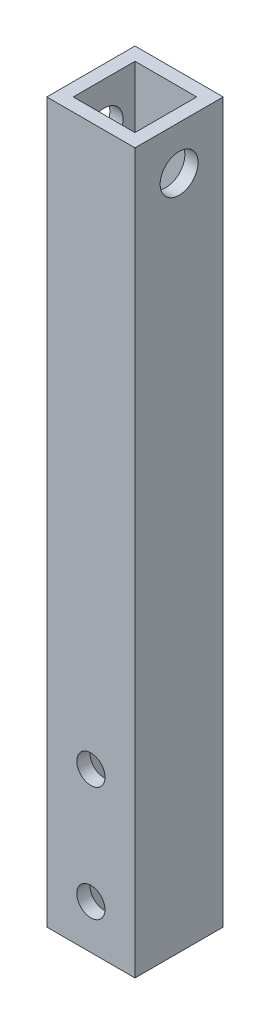
ISO-10303-21;
HEADER;
FILE_DESCRIPTION(('STEP AP214'),'2;1');
FILE_NAME('part.step','',(''),(''),'','','');
FILE_SCHEMA(('AUTOMOTIVE_DESIGN { 1 0 10303 214 1 1 1 1 }'));
ENDSEC;
DATA;
#1=APPLICATION_CONTEXT('core data for automotive mechanical design processes');
#2=APPLICATION_PROTOCOL_DEFINITION('international standard','automotive_design',2000,#1);
#3=PRODUCT_CONTEXT('',#1,'mechanical');
#4=PRODUCT('Part','Part','',(#3));
#5=PRODUCT_RELATED_PRODUCT_CATEGORY('part','',(#4));
#6=PRODUCT_DEFINITION_FORMATION('','',#4);
#7=PRODUCT_DEFINITION_CONTEXT('part definition',#1,'design');
#8=PRODUCT_DEFINITION('design','',#6,#7);
#9=PRODUCT_DEFINITION_SHAPE('','',#8);
#10=(LENGTH_UNIT() NAMED_UNIT(*) SI_UNIT(.MILLI.,.METRE.));
#11=(NAMED_UNIT(*) PLANE_ANGLE_UNIT() SI_UNIT($,.RADIAN.));
#12=(NAMED_UNIT(*) SI_UNIT($,.STERADIAN.) SOLID_ANGLE_UNIT());
#13=UNCERTAINTY_MEASURE_WITH_UNIT(LENGTH_MEASURE(1.E-05),#10,'distance_accuracy_value','');
#14=(GEOMETRIC_REPRESENTATION_CONTEXT(3) GLOBAL_UNCERTAINTY_ASSIGNED_CONTEXT((#13)) GLOBAL_UNIT_ASSIGNED_CONTEXT((#10,
#11,#12)) REPRESENTATION_CONTEXT('',''));
#15=CARTESIAN_POINT('',(0.,0.,0.));
#16=DIRECTION('',(0.,0.,1.));
#17=DIRECTION('',(1.,0.,0.));
#18=AXIS2_PLACEMENT_3D('',#15,#16,#17);
#19=CARTESIAN_POINT('',(0.,81.5,0.));
#20=DIRECTION('',(0.,1.,0.));
#21=DIRECTION('',(0.,0.,1.));
#22=AXIS2_PLACEMENT_3D('',#19,#20,#21);
#23=PLANE('',#22);
#24=DIRECTION('',(0.,0.,-1.));
#25=VECTOR('',#24,1.);
#26=CARTESIAN_POINT('',(5.,81.5,-5.));
#27=LINE('',#26,#25);
#28=CARTESIAN_POINT('',(5.,81.5,5.));
#29=VERTEX_POINT('',#28);
#30=CARTESIAN_POINT('',(5.,81.5,-5.));
#31=VERTEX_POINT('',#30);
#32=EDGE_CURVE('E164',#29,#31,#27,.T.);
#33=ORIENTED_EDGE('',*,*,#32,.T.);
#34=DIRECTION('',(-1.,0.,0.));
#35=VECTOR('',#34,1.);
#36=CARTESIAN_POINT('',(-5.,81.5,-5.));
#37=LINE('',#36,#35);
#38=CARTESIAN_POINT('',(-5.,81.5,-5.));
#39=VERTEX_POINT('',#38);
#40=EDGE_CURVE('E167',#31,#39,#37,.T.);
#41=ORIENTED_EDGE('',*,*,#40,.T.);
#42=DIRECTION('',(0.,0.,1.));
#43=VECTOR('',#42,1.);
#44=CARTESIAN_POINT('',(-5.,81.5,-5.));
#45=LINE('',#44,#43);
#46=CARTESIAN_POINT('',(-5.,81.5,5.));
#47=VERTEX_POINT('',#46);
#48=EDGE_CURVE('E170',#39,#47,#45,.T.);
#49=ORIENTED_EDGE('',*,*,#48,.T.);
#50=DIRECTION('',(1.,0.,0.));
#51=VECTOR('',#50,1.);
#52=CARTESIAN_POINT('',(-5.,81.5,5.));
#53=LINE('',#52,#51);
#54=EDGE_CURVE('E172',#47,#29,#53,.T.);
#55=ORIENTED_EDGE('',*,*,#54,.T.);
#56=EDGE_LOOP('',(#33,#41,#49,#55));
#57=FACE_BOUND('',#56,.T.);
#58=DIRECTION('',(-1.,0.,0.));
#59=VECTOR('',#58,1.);
#60=CARTESIAN_POINT('',(-5.,81.5,-3.5));
#61=LINE('',#60,#59);
#62=CARTESIAN_POINT('',(3.5,81.5,-3.5));
#63=VERTEX_POINT('',#62);
#64=CARTESIAN_POINT('',(-3.5,81.5,-3.5));
#65=VERTEX_POINT('',#64);
#66=EDGE_CURVE('E134',#63,#65,#61,.T.);
#67=ORIENTED_EDGE('',*,*,#66,.F.);
#68=DIRECTION('',(0.,0.,-1.));
#69=VECTOR('',#68,1.);
#70=CARTESIAN_POINT('',(3.5,81.5,-5.));
#71=LINE('',#70,#69);
#72=CARTESIAN_POINT('',(3.5,81.5,3.5));
#73=VERTEX_POINT('',#72);
#74=EDGE_CURVE('E126',#73,#63,#71,.T.);
#75=ORIENTED_EDGE('',*,*,#74,.F.);
#76=DIRECTION('',(1.,0.,0.));
#77=VECTOR('',#76,1.);
#78=CARTESIAN_POINT('',(-5.,81.5,3.5));
#79=LINE('',#78,#77);
#80=CARTESIAN_POINT('',(-3.5,81.5,3.5));
#81=VERTEX_POINT('',#80);
#82=EDGE_CURVE('E148',#81,#73,#79,.T.);
#83=ORIENTED_EDGE('',*,*,#82,.F.);
#84=DIRECTION('',(0.,0.,1.));
#85=VECTOR('',#84,1.);
#86=CARTESIAN_POINT('',(-3.5,81.5,-5.));
#87=LINE('',#86,#85);
#88=EDGE_CURVE('E146',#65,#81,#87,.T.);
#89=ORIENTED_EDGE('',*,*,#88,.F.);
#90=EDGE_LOOP('',(#67,#75,#83,#89));
#91=FACE_BOUND('',#90,.T.);
#92=ADVANCED_FACE('F59',(#57,#91),#23,.T.);
#93=CARTESIAN_POINT('',(0.,0.,0.));
#94=DIRECTION('',(0.,1.,0.));
#95=DIRECTION('',(0.,0.,1.));
#96=AXIS2_PLACEMENT_3D('',#93,#94,#95);
#97=PLANE('',#96);
#98=DIRECTION('',(0.,0.,-1.));
#99=VECTOR('',#98,1.);
#100=CARTESIAN_POINT('',(5.,0.,-5.));
#101=LINE('',#100,#99);
#102=CARTESIAN_POINT('',(5.,0.,5.));
#103=VERTEX_POINT('',#102);
#104=CARTESIAN_POINT('',(5.,0.,-5.));
#105=VERTEX_POINT('',#104);
#106=EDGE_CURVE('E142',#103,#105,#101,.T.);
#107=ORIENTED_EDGE('',*,*,#106,.F.);
#108=DIRECTION('',(1.,0.,0.));
#109=VECTOR('',#108,1.);
#110=CARTESIAN_POINT('',(-5.,0.,5.));
#111=LINE('',#110,#109);
#112=CARTESIAN_POINT('',(-5.,0.,5.));
#113=VERTEX_POINT('',#112);
#114=EDGE_CURVE('E168',#113,#103,#111,.T.);
#115=ORIENTED_EDGE('',*,*,#114,.F.);
#116=DIRECTION('',(0.,0.,1.));
#117=VECTOR('',#116,1.);
#118=CARTESIAN_POINT('',(-5.,0.,-5.));
#119=LINE('',#118,#117);
#120=CARTESIAN_POINT('',(-5.,0.,-5.));
#121=VERTEX_POINT('',#120);
#122=EDGE_CURVE('E179',#121,#113,#119,.T.);
#123=ORIENTED_EDGE('',*,*,#122,.F.);
#124=DIRECTION('',(-1.,0.,0.));
#125=VECTOR('',#124,1.);
#126=CARTESIAN_POINT('',(-5.,0.,-5.));
#127=LINE('',#126,#125);
#128=EDGE_CURVE('E177',#105,#121,#127,.T.);
#129=ORIENTED_EDGE('',*,*,#128,.F.);
#130=EDGE_LOOP('',(#107,#115,#123,#129));
#131=FACE_BOUND('',#130,.T.);
#132=DIRECTION('',(0.,0.,-1.));
#133=VECTOR('',#132,1.);
#134=CARTESIAN_POINT('',(3.5,0.,-5.));
#135=LINE('',#134,#133);
#136=CARTESIAN_POINT('',(3.5,0.,3.5));
#137=VERTEX_POINT('',#136);
#138=CARTESIAN_POINT('',(3.5,0.,-3.5));
#139=VERTEX_POINT('',#138);
#140=EDGE_CURVE('E84',#137,#139,#135,.T.);
#141=ORIENTED_EDGE('',*,*,#140,.T.);
#142=DIRECTION('',(-1.,0.,0.));
#143=VECTOR('',#142,1.);
#144=CARTESIAN_POINT('',(-5.,0.,-3.5));
#145=LINE('',#144,#143);
#146=CARTESIAN_POINT('',(-3.5,0.,-3.5));
#147=VERTEX_POINT('',#146);
#148=EDGE_CURVE('E141',#139,#147,#145,.T.);
#149=ORIENTED_EDGE('',*,*,#148,.T.);
#150=DIRECTION('',(0.,0.,1.));
#151=VECTOR('',#150,1.);
#152=CARTESIAN_POINT('',(-3.5,0.,-5.));
#153=LINE('',#152,#151);
#154=CARTESIAN_POINT('',(-3.5,0.,3.5));
#155=VERTEX_POINT('',#154);
#156=EDGE_CURVE('E156',#147,#155,#153,.T.);
#157=ORIENTED_EDGE('',*,*,#156,.T.);
#158=DIRECTION('',(1.,0.,0.));
#159=VECTOR('',#158,1.);
#160=CARTESIAN_POINT('',(-5.,0.,3.5));
#161=LINE('',#160,#159);
#162=EDGE_CURVE('E135',#155,#137,#161,.T.);
#163=ORIENTED_EDGE('',*,*,#162,.T.);
#164=EDGE_LOOP('',(#141,#149,#157,#163));
#165=FACE_BOUND('',#164,.T.);
#166=ADVANCED_FACE('F237',(#131,#165),#97,.F.);
#167=CARTESIAN_POINT('',(5.,81.5,-5.));
#168=DIRECTION('',(-1.,0.,0.));
#169=DIRECTION('',(0.,0.,1.));
#170=AXIS2_PLACEMENT_3D('',#167,#168,#169);
#171=PLANE('',#170);
#172=CARTESIAN_POINT('',(5.,76.5,0.));
#173=DIRECTION('',(1.,0.,0.));
#174=DIRECTION('',(0.,0.,-1.));
#175=AXIS2_PLACEMENT_3D('',#172,#173,#174);
#176=CIRCLE('',#175,2.15);
#177=CARTESIAN_POINT('',(5.,76.5,-2.15));
#178=VERTEX_POINT('',#177);
#179=EDGE_CURVE('E217',#178,#178,#176,.T.);
#180=ORIENTED_EDGE('',*,*,#179,.F.);
#181=EDGE_LOOP('',(#180));
#182=FACE_BOUND('',#181,.T.);
#183=ORIENTED_EDGE('',*,*,#106,.T.);
#184=DIRECTION('',(0.,-1.,0.));
#185=VECTOR('',#184,1.);
#186=CARTESIAN_POINT('',(5.,81.5,-5.));
#187=LINE('',#186,#185);
#188=EDGE_CURVE('E12',#31,#105,#187,.T.);
#189=ORIENTED_EDGE('',*,*,#188,.F.);
#190=ORIENTED_EDGE('',*,*,#32,.F.);
#191=DIRECTION('',(0.,-1.,0.));
#192=VECTOR('',#191,1.);
#193=CARTESIAN_POINT('',(5.,81.5,5.));
#194=LINE('',#193,#192);
#195=EDGE_CURVE('E174',#29,#103,#194,.T.);
#196=ORIENTED_EDGE('',*,*,#195,.T.);
#197=EDGE_LOOP('',(#183,#189,#190,#196));
#198=FACE_BOUND('',#197,.T.);
#199=ADVANCED_FACE('F61',(#182,#198),#171,.F.);
#200=CARTESIAN_POINT('',(-5.,81.5,-5.));
#201=DIRECTION('',(0.,0.,1.));
#202=DIRECTION('',(1.,0.,0.));
#203=AXIS2_PLACEMENT_3D('',#200,#201,#202);
#204=PLANE('',#203);
#205=CARTESIAN_POINT('',(0.,18.,-5.));
#206=DIRECTION('',(0.,0.,1.));
#207=DIRECTION('',(1.,0.,0.));
#208=AXIS2_PLACEMENT_3D('',#205,#206,#207);
#209=CIRCLE('',#208,1.6);
#210=CARTESIAN_POINT('',(1.6,18.,-5.));
#211=VERTEX_POINT('',#210);
#212=EDGE_CURVE('E192',#211,#211,#209,.T.);
#213=ORIENTED_EDGE('',*,*,#212,.T.);
#214=EDGE_LOOP('',(#213));
#215=FACE_BOUND('',#214,.T.);
#216=CARTESIAN_POINT('',(0.,5.,-5.));
#217=DIRECTION('',(0.,0.,1.));
#218=DIRECTION('',(1.,0.,0.));
#219=AXIS2_PLACEMENT_3D('',#216,#217,#218);
#220=CIRCLE('',#219,1.6);
#221=CARTESIAN_POINT('',(1.6,5.,-5.));
#222=VERTEX_POINT('',#221);
#223=EDGE_CURVE('E206',#222,#222,#220,.T.);
#224=ORIENTED_EDGE('',*,*,#223,.T.);
#225=EDGE_LOOP('',(#224));
#226=FACE_BOUND('',#225,.T.);
#227=ORIENTED_EDGE('',*,*,#128,.T.);
#228=DIRECTION('',(0.,-1.,0.));
#229=VECTOR('',#228,1.);
#230=CARTESIAN_POINT('',(-5.,81.5,-5.));
#231=LINE('',#230,#229);
#232=EDGE_CURVE('E68',#39,#121,#231,.T.);
#233=ORIENTED_EDGE('',*,*,#232,.F.);
#234=ORIENTED_EDGE('',*,*,#40,.F.);
#235=ORIENTED_EDGE('',*,*,#188,.T.);
#236=EDGE_LOOP('',(#227,#233,#234,#235));
#237=FACE_BOUND('',#236,.T.);
#238=ADVANCED_FACE('F267',(#215,#226,#237),#204,.F.);
#239=CARTESIAN_POINT('',(-5.,81.5,-5.));
#240=DIRECTION('',(1.,0.,0.));
#241=DIRECTION('',(0.,0.,-1.));
#242=AXIS2_PLACEMENT_3D('',#239,#240,#241);
#243=PLANE('',#242);
#244=CARTESIAN_POINT('',(-5.,76.5,0.));
#245=DIRECTION('',(1.,0.,0.));
#246=DIRECTION('',(0.,0.,-1.));
#247=AXIS2_PLACEMENT_3D('',#244,#245,#246);
#248=CIRCLE('',#247,2.15);
#249=CARTESIAN_POINT('',(-5.,76.5,-2.15));
#250=VERTEX_POINT('',#249);
#251=EDGE_CURVE('E220',#250,#250,#248,.T.);
#252=ORIENTED_EDGE('',*,*,#251,.T.);
#253=EDGE_LOOP('',(#252));
#254=FACE_BOUND('',#253,.T.);
#255=ORIENTED_EDGE('',*,*,#122,.T.);
#256=DIRECTION('',(0.,-1.,0.));
#257=VECTOR('',#256,1.);
#258=CARTESIAN_POINT('',(-5.,81.5,5.));
#259=LINE('',#258,#257);
#260=EDGE_CURVE('E184',#47,#113,#259,.T.);
#261=ORIENTED_EDGE('',*,*,#260,.F.);
#262=ORIENTED_EDGE('',*,*,#48,.F.);
#263=ORIENTED_EDGE('',*,*,#232,.T.);
#264=EDGE_LOOP('',(#255,#261,#262,#263));
#265=FACE_BOUND('',#264,.T.);
#266=ADVANCED_FACE('F264',(#254,#265),#243,.F.);
#267=CARTESIAN_POINT('',(-5.,81.5,5.));
#268=DIRECTION('',(0.,0.,-1.));
#269=DIRECTION('',(-1.,0.,0.));
#270=AXIS2_PLACEMENT_3D('',#267,#268,#269);
#271=PLANE('',#270);
#272=CARTESIAN_POINT('',(0.,18.,5.));
#273=DIRECTION('',(0.,0.,1.));
#274=DIRECTION('',(1.,0.,0.));
#275=AXIS2_PLACEMENT_3D('',#272,#273,#274);
#276=CIRCLE('',#275,1.6);
#277=CARTESIAN_POINT('',(1.6,18.,5.));
#278=VERTEX_POINT('',#277);
#279=EDGE_CURVE('E210',#278,#278,#276,.T.);
#280=ORIENTED_EDGE('',*,*,#279,.F.);
#281=EDGE_LOOP('',(#280));
#282=FACE_BOUND('',#281,.T.);
#283=CARTESIAN_POINT('',(0.,5.,5.));
#284=DIRECTION('',(0.,0.,1.));
#285=DIRECTION('',(1.,0.,0.));
#286=AXIS2_PLACEMENT_3D('',#283,#284,#285);
#287=CIRCLE('',#286,1.6);
#288=CARTESIAN_POINT('',(1.6,5.,5.));
#289=VERTEX_POINT('',#288);
#290=EDGE_CURVE('E203',#289,#289,#287,.T.);
#291=ORIENTED_EDGE('',*,*,#290,.F.);
#292=EDGE_LOOP('',(#291));
#293=FACE_BOUND('',#292,.T.);
#294=ORIENTED_EDGE('',*,*,#114,.T.);
#295=ORIENTED_EDGE('',*,*,#195,.F.);
#296=ORIENTED_EDGE('',*,*,#54,.F.);
#297=ORIENTED_EDGE('',*,*,#260,.T.);
#298=EDGE_LOOP('',(#294,#295,#296,#297));
#299=FACE_BOUND('',#298,.T.);
#300=ADVANCED_FACE('F261',(#282,#293,#299),#271,.F.);
#301=CARTESIAN_POINT('',(3.5,81.5,-5.));
#302=DIRECTION('',(-1.,0.,0.));
#303=DIRECTION('',(0.,0.,1.));
#304=AXIS2_PLACEMENT_3D('',#301,#302,#303);
#305=PLANE('',#304);
#306=CARTESIAN_POINT('',(3.5,76.5,0.));
#307=DIRECTION('',(-1.,0.,0.));
#308=DIRECTION('',(0.,0.,1.));
#309=AXIS2_PLACEMENT_3D('',#306,#307,#308);
#310=CIRCLE('',#309,2.15);
#311=CARTESIAN_POINT('',(3.5,76.5,2.15));
#312=VERTEX_POINT('',#311);
#313=EDGE_CURVE('E207',#312,#312,#310,.T.);
#314=ORIENTED_EDGE('',*,*,#313,.F.);
#315=EDGE_LOOP('',(#314));
#316=FACE_BOUND('',#315,.T.);
#317=ORIENTED_EDGE('',*,*,#140,.F.);
#318=DIRECTION('',(0.,-1.,0.));
#319=VECTOR('',#318,1.);
#320=CARTESIAN_POINT('',(3.5,81.5,3.5));
#321=LINE('',#320,#319);
#322=EDGE_CURVE('E130',#73,#137,#321,.T.);
#323=ORIENTED_EDGE('',*,*,#322,.F.);
#324=ORIENTED_EDGE('',*,*,#74,.T.);
#325=DIRECTION('',(0.,-1.,0.));
#326=VECTOR('',#325,1.);
#327=CARTESIAN_POINT('',(3.5,81.5,-3.5));
#328=LINE('',#327,#326);
#329=EDGE_CURVE('E129',#63,#139,#328,.T.);
#330=ORIENTED_EDGE('',*,*,#329,.T.);
#331=EDGE_LOOP('',(#317,#323,#324,#330));
#332=FACE_BOUND('',#331,.T.);
#333=ADVANCED_FACE('F128',(#316,#332),#305,.T.);
#334=CARTESIAN_POINT('',(-5.,81.5,-3.5));
#335=DIRECTION('',(0.,0.,1.));
#336=DIRECTION('',(1.,0.,0.));
#337=AXIS2_PLACEMENT_3D('',#334,#335,#336);
#338=PLANE('',#337);
#339=CARTESIAN_POINT('',(0.,18.,-3.5));
#340=DIRECTION('',(0.,0.,1.));
#341=DIRECTION('',(1.,0.,0.));
#342=AXIS2_PLACEMENT_3D('',#339,#340,#341);
#343=CIRCLE('',#342,1.6);
#344=CARTESIAN_POINT('',(1.6,18.,-3.5));
#345=VERTEX_POINT('',#344);
#346=EDGE_CURVE('E154',#345,#345,#343,.T.);
#347=ORIENTED_EDGE('',*,*,#346,.F.);
#348=EDGE_LOOP('',(#347));
#349=FACE_BOUND('',#348,.T.);
#350=CARTESIAN_POINT('',(0.,5.,-3.5));
#351=DIRECTION('',(0.,0.,1.));
#352=DIRECTION('',(1.,0.,0.));
#353=AXIS2_PLACEMENT_3D('',#350,#351,#352);
#354=CIRCLE('',#353,1.6);
#355=CARTESIAN_POINT('',(1.6,5.,-3.5));
#356=VERTEX_POINT('',#355);
#357=EDGE_CURVE('E191',#356,#356,#354,.T.);
#358=ORIENTED_EDGE('',*,*,#357,.F.);
#359=EDGE_LOOP('',(#358));
#360=FACE_BOUND('',#359,.T.);
#361=ORIENTED_EDGE('',*,*,#148,.F.);
#362=ORIENTED_EDGE('',*,*,#329,.F.);
#363=ORIENTED_EDGE('',*,*,#66,.T.);
#364=DIRECTION('',(0.,-1.,0.));
#365=VECTOR('',#364,1.);
#366=CARTESIAN_POINT('',(-3.5,81.5,-3.5));
#367=LINE('',#366,#365);
#368=EDGE_CURVE('E143',#65,#147,#367,.T.);
#369=ORIENTED_EDGE('',*,*,#368,.T.);
#370=EDGE_LOOP('',(#361,#362,#363,#369));
#371=FACE_BOUND('',#370,.T.);
#372=ADVANCED_FACE('F138',(#349,#360,#371),#338,.T.);
#373=CARTESIAN_POINT('',(-3.5,81.5,-5.));
#374=DIRECTION('',(1.,0.,0.));
#375=DIRECTION('',(0.,0.,-1.));
#376=AXIS2_PLACEMENT_3D('',#373,#374,#375);
#377=PLANE('',#376);
#378=CARTESIAN_POINT('',(-3.5,76.5,0.));
#379=DIRECTION('',(1.,0.,0.));
#380=DIRECTION('',(0.,0.,-1.));
#381=AXIS2_PLACEMENT_3D('',#378,#379,#380);
#382=CIRCLE('',#381,2.15);
#383=CARTESIAN_POINT('',(-3.5,76.5,-2.15));
#384=VERTEX_POINT('',#383);
#385=EDGE_CURVE('E63',#384,#384,#382,.T.);
#386=ORIENTED_EDGE('',*,*,#385,.F.);
#387=EDGE_LOOP('',(#386));
#388=FACE_BOUND('',#387,.T.);
#389=ORIENTED_EDGE('',*,*,#156,.F.);
#390=ORIENTED_EDGE('',*,*,#368,.F.);
#391=ORIENTED_EDGE('',*,*,#88,.T.);
#392=DIRECTION('',(0.,-1.,0.));
#393=VECTOR('',#392,1.);
#394=CARTESIAN_POINT('',(-3.5,81.5,3.5));
#395=LINE('',#394,#393);
#396=EDGE_CURVE('E76',#81,#155,#395,.T.);
#397=ORIENTED_EDGE('',*,*,#396,.T.);
#398=EDGE_LOOP('',(#389,#390,#391,#397));
#399=FACE_BOUND('',#398,.T.);
#400=ADVANCED_FACE('F230',(#388,#399),#377,.T.);
#401=CARTESIAN_POINT('',(-5.,81.5,3.5));
#402=DIRECTION('',(0.,0.,-1.));
#403=DIRECTION('',(-1.,0.,0.));
#404=AXIS2_PLACEMENT_3D('',#401,#402,#403);
#405=PLANE('',#404);
#406=CARTESIAN_POINT('',(0.,18.,3.5));
#407=DIRECTION('',(0.,0.,-1.));
#408=DIRECTION('',(-1.,0.,0.));
#409=AXIS2_PLACEMENT_3D('',#406,#407,#408);
#410=CIRCLE('',#409,1.6);
#411=CARTESIAN_POINT('',(-1.6,18.,3.5));
#412=VERTEX_POINT('',#411);
#413=EDGE_CURVE('E193',#412,#412,#410,.T.);
#414=ORIENTED_EDGE('',*,*,#413,.F.);
#415=EDGE_LOOP('',(#414));
#416=FACE_BOUND('',#415,.T.);
#417=CARTESIAN_POINT('',(0.,5.,3.5));
#418=DIRECTION('',(0.,0.,-1.));
#419=DIRECTION('',(-1.,0.,0.));
#420=AXIS2_PLACEMENT_3D('',#417,#418,#419);
#421=CIRCLE('',#420,1.6);
#422=CARTESIAN_POINT('',(-1.6,5.,3.5));
#423=VERTEX_POINT('',#422);
#424=EDGE_CURVE('E189',#423,#423,#421,.T.);
#425=ORIENTED_EDGE('',*,*,#424,.F.);
#426=EDGE_LOOP('',(#425));
#427=FACE_BOUND('',#426,.T.);
#428=ORIENTED_EDGE('',*,*,#162,.F.);
#429=ORIENTED_EDGE('',*,*,#396,.F.);
#430=ORIENTED_EDGE('',*,*,#82,.T.);
#431=ORIENTED_EDGE('',*,*,#322,.T.);
#432=EDGE_LOOP('',(#428,#429,#430,#431));
#433=FACE_BOUND('',#432,.T.);
#434=ADVANCED_FACE('F233',(#416,#427,#433),#405,.T.);
#435=CARTESIAN_POINT('',(0.,5.,-5.));
#436=DIRECTION('',(0.,0.,1.));
#437=DIRECTION('',(1.,0.,0.));
#438=AXIS2_PLACEMENT_3D('',#435,#436,#437);
#439=CYLINDRICAL_SURFACE('',#438,1.6);
#440=ORIENTED_EDGE('',*,*,#424,.T.);
#441=EDGE_LOOP('',(#440));
#442=FACE_BOUND('',#441,.T.);
#443=ORIENTED_EDGE('',*,*,#290,.T.);
#444=EDGE_LOOP('',(#443));
#445=FACE_BOUND('',#444,.T.);
#446=ADVANCED_FACE('F239',(#442,#445),#439,.F.);
#447=CARTESIAN_POINT('',(0.,18.,-5.));
#448=DIRECTION('',(0.,0.,1.));
#449=DIRECTION('',(1.,0.,0.));
#450=AXIS2_PLACEMENT_3D('',#447,#448,#449);
#451=CYLINDRICAL_SURFACE('',#450,1.6);
#452=ORIENTED_EDGE('',*,*,#413,.T.);
#453=EDGE_LOOP('',(#452));
#454=FACE_BOUND('',#453,.T.);
#455=ORIENTED_EDGE('',*,*,#279,.T.);
#456=EDGE_LOOP('',(#455));
#457=FACE_BOUND('',#456,.T.);
#458=ADVANCED_FACE('F245',(#454,#457),#451,.F.);
#459=ORIENTED_EDGE('',*,*,#357,.T.);
#460=EDGE_LOOP('',(#459));
#461=FACE_BOUND('',#460,.T.);
#462=ORIENTED_EDGE('',*,*,#223,.F.);
#463=EDGE_LOOP('',(#462));
#464=FACE_BOUND('',#463,.T.);
#465=ADVANCED_FACE('F248',(#461,#464),#439,.F.);
#466=ORIENTED_EDGE('',*,*,#346,.T.);
#467=EDGE_LOOP('',(#466));
#468=FACE_BOUND('',#467,.T.);
#469=ORIENTED_EDGE('',*,*,#212,.F.);
#470=EDGE_LOOP('',(#469));
#471=FACE_BOUND('',#470,.T.);
#472=ADVANCED_FACE('F293',(#468,#471),#451,.F.);
#473=CARTESIAN_POINT('',(-5.,76.5,0.));
#474=DIRECTION('',(1.,0.,0.));
#475=DIRECTION('',(0.,0.,-1.));
#476=AXIS2_PLACEMENT_3D('',#473,#474,#475);
#477=CYLINDRICAL_SURFACE('',#476,2.15);
#478=ORIENTED_EDGE('',*,*,#385,.T.);
#479=EDGE_LOOP('',(#478));
#480=FACE_BOUND('',#479,.T.);
#481=ORIENTED_EDGE('',*,*,#251,.F.);
#482=EDGE_LOOP('',(#481));
#483=FACE_BOUND('',#482,.T.);
#484=ADVANCED_FACE('F227',(#480,#483),#477,.F.);
#485=ORIENTED_EDGE('',*,*,#313,.T.);
#486=EDGE_LOOP('',(#485));
#487=FACE_BOUND('',#486,.T.);
#488=ORIENTED_EDGE('',*,*,#179,.T.);
#489=EDGE_LOOP('',(#488));
#490=FACE_BOUND('',#489,.T.);
#491=ADVANCED_FACE('F302',(#487,#490),#477,.F.);
#492=CLOSED_SHELL('',(#92,#166,#199,#238,#266,#300,#333,#372,#400,#434,#446,#458,#465,#472,#484,#491));
#493=MANIFOLD_SOLID_BREP('B2',#492);
#494=ADVANCED_BREP_SHAPE_REPRESENTATION('',(#18,#493),#14);
#495=SHAPE_DEFINITION_REPRESENTATION(#9,#494);
ENDSEC;
END-ISO-10303-21;
